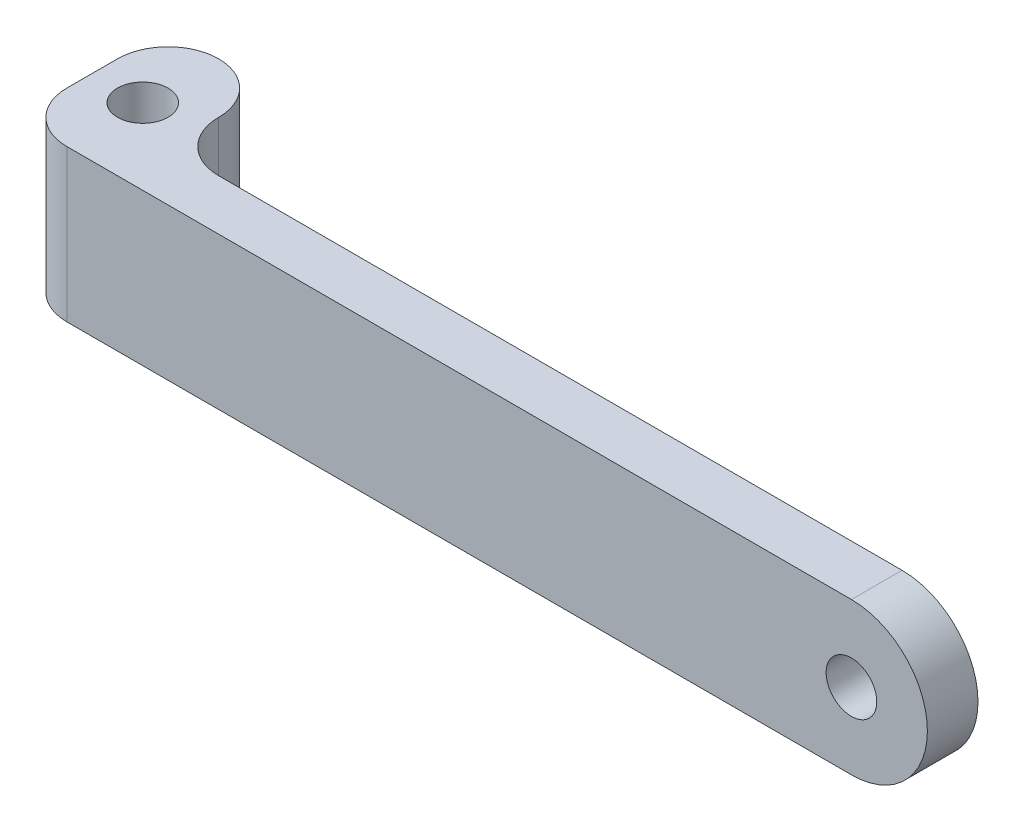
ISO-10303-21;
HEADER;
FILE_DESCRIPTION(('STEP AP214'),'2;1');
FILE_NAME('part.step','',(''),(''),'','','');
FILE_SCHEMA(('AUTOMOTIVE_DESIGN { 1 0 10303 214 1 1 1 1 }'));
ENDSEC;
DATA;
#1=APPLICATION_CONTEXT('core data for automotive mechanical design processes');
#2=APPLICATION_PROTOCOL_DEFINITION('international standard','automotive_design',2000,#1);
#3=PRODUCT_CONTEXT('',#1,'mechanical');
#4=PRODUCT('Part','Part','',(#3));
#5=PRODUCT_RELATED_PRODUCT_CATEGORY('part','',(#4));
#6=PRODUCT_DEFINITION_FORMATION('','',#4);
#7=PRODUCT_DEFINITION_CONTEXT('part definition',#1,'design');
#8=PRODUCT_DEFINITION('design','',#6,#7);
#9=PRODUCT_DEFINITION_SHAPE('','',#8);
#10=(LENGTH_UNIT() NAMED_UNIT(*) SI_UNIT(.MILLI.,.METRE.));
#11=(NAMED_UNIT(*) PLANE_ANGLE_UNIT() SI_UNIT($,.RADIAN.));
#12=(NAMED_UNIT(*) SI_UNIT($,.STERADIAN.) SOLID_ANGLE_UNIT());
#13=UNCERTAINTY_MEASURE_WITH_UNIT(LENGTH_MEASURE(1.E-05),#10,'distance_accuracy_value','');
#14=(GEOMETRIC_REPRESENTATION_CONTEXT(3) GLOBAL_UNCERTAINTY_ASSIGNED_CONTEXT((#13)) GLOBAL_UNIT_ASSIGNED_CONTEXT((#10,
#11,#12)) REPRESENTATION_CONTEXT('',''));
#15=CARTESIAN_POINT('',(0.,0.,0.));
#16=DIRECTION('',(0.,0.,1.));
#17=DIRECTION('',(1.,0.,0.));
#18=AXIS2_PLACEMENT_3D('',#15,#16,#17);
#19=CARTESIAN_POINT('',(0.,-7.5,5.));
#20=DIRECTION('',(0.,1.,0.));
#21=DIRECTION('',(-1.,0.,0.));
#22=AXIS2_PLACEMENT_3D('',#19,#20,#21);
#23=PLANE('',#22);
#24=CARTESIAN_POINT('',(-2.5,-7.5,-2.5));
#25=DIRECTION('',(0.,1.,0.));
#26=DIRECTION('',(-1.,0.,0.));
#27=AXIS2_PLACEMENT_3D('',#24,#25,#26);
#28=CIRCLE('',#27,2.5);
#29=CARTESIAN_POINT('',(-5.,-7.5,-2.5));
#30=VERTEX_POINT('',#29);
#31=EDGE_CURVE('E169',#30,#30,#28,.T.);
#32=ORIENTED_EDGE('',*,*,#31,.T.);
#33=EDGE_LOOP('',(#32));
#34=FACE_BOUND('',#33,.T.);
#35=DIRECTION('',(1.,0.,0.));
#36=VECTOR('',#35,1.);
#37=CARTESIAN_POINT('',(0.,-7.5,5.));
#38=LINE('',#37,#36);
#39=CARTESIAN_POINT('',(-2.5,-7.5,5.));
#40=VERTEX_POINT('',#39);
#41=CARTESIAN_POINT('',(75.,-7.5,5.));
#42=VERTEX_POINT('',#41);
#43=EDGE_CURVE('E100',#40,#42,#38,.T.);
#44=ORIENTED_EDGE('',*,*,#43,.F.);
#45=CARTESIAN_POINT('',(-2.5,-7.5,0.));
#46=DIRECTION('',(0.,1.,0.));
#47=DIRECTION('',(-1.,0.,0.));
#48=AXIS2_PLACEMENT_3D('',#45,#46,#47);
#49=CIRCLE('',#48,5.);
#50=CARTESIAN_POINT('',(-7.5,-7.5,0.));
#51=VERTEX_POINT('',#50);
#52=EDGE_CURVE('E155',#40,#51,#49,.F.);
#53=ORIENTED_EDGE('',*,*,#52,.T.);
#54=DIRECTION('',(0.,0.,1.));
#55=VECTOR('',#54,1.);
#56=CARTESIAN_POINT('',(-7.5,-7.5,5.));
#57=LINE('',#56,#55);
#58=CARTESIAN_POINT('',(-7.5,-7.5,-5.));
#59=VERTEX_POINT('',#58);
#60=EDGE_CURVE('E134',#59,#51,#57,.T.);
#61=ORIENTED_EDGE('',*,*,#60,.F.);
#62=CARTESIAN_POINT('',(-2.5,-7.5,-5.));
#63=DIRECTION('',(0.,1.,0.));
#64=DIRECTION('',(-1.,0.,0.));
#65=AXIS2_PLACEMENT_3D('',#62,#63,#64);
#66=CIRCLE('',#65,5.);
#67=CARTESIAN_POINT('',(-2.5,-7.5,-10.));
#68=VERTEX_POINT('',#67);
#69=EDGE_CURVE('E152',#59,#68,#66,.F.);
#70=ORIENTED_EDGE('',*,*,#69,.T.);
#71=CARTESIAN_POINT('',(-2.5,-7.5,-5.));
#72=DIRECTION('',(0.,1.,0.));
#73=DIRECTION('',(-1.,0.,0.));
#74=AXIS2_PLACEMENT_3D('',#71,#72,#73);
#75=CIRCLE('',#74,5.);
#76=CARTESIAN_POINT('',(2.5,-7.5,-5.));
#77=VERTEX_POINT('',#76);
#78=EDGE_CURVE('E56',#68,#77,#75,.F.);
#79=ORIENTED_EDGE('',*,*,#78,.T.);
#80=CARTESIAN_POINT('',(7.5,-7.5,-5.));
#81=DIRECTION('',(0.,1.,0.));
#82=DIRECTION('',(-1.,0.,0.));
#83=AXIS2_PLACEMENT_3D('',#80,#81,#82);
#84=CIRCLE('',#83,5.);
#85=CARTESIAN_POINT('',(7.5,-7.5,0.));
#86=VERTEX_POINT('',#85);
#87=EDGE_CURVE('E11',#77,#86,#84,.T.);
#88=ORIENTED_EDGE('',*,*,#87,.T.);
#89=DIRECTION('',(1.,0.,0.));
#90=VECTOR('',#89,1.);
#91=CARTESIAN_POINT('',(0.,-7.5,0.));
#92=LINE('',#91,#90);
#93=CARTESIAN_POINT('',(75.,-7.5,0.));
#94=VERTEX_POINT('',#93);
#95=EDGE_CURVE('E115',#86,#94,#92,.T.);
#96=ORIENTED_EDGE('',*,*,#95,.T.);
#97=DIRECTION('',(0.,0.,-1.));
#98=VECTOR('',#97,1.);
#99=CARTESIAN_POINT('',(75.,-7.5,5.));
#100=LINE('',#99,#98);
#101=EDGE_CURVE('E114',#42,#94,#100,.T.);
#102=ORIENTED_EDGE('',*,*,#101,.F.);
#103=EDGE_LOOP('',(#44,#53,#61,#70,#79,#88,#96,#102));
#104=FACE_BOUND('',#103,.T.);
#105=ADVANCED_FACE('F36',(#34,#104),#23,.F.);
#106=CARTESIAN_POINT('',(75.,0.,5.));
#107=DIRECTION('',(0.,0.,-1.));
#108=DIRECTION('',(-1.,0.,0.));
#109=AXIS2_PLACEMENT_3D('',#106,#107,#108);
#110=CYLINDRICAL_SURFACE('',#109,7.5);
#111=CARTESIAN_POINT('',(75.,0.,0.));
#112=DIRECTION('',(0.,0.,1.));
#113=DIRECTION('',(1.,0.,0.));
#114=AXIS2_PLACEMENT_3D('',#111,#112,#113);
#115=CIRCLE('',#114,7.5);
#116=CARTESIAN_POINT('',(75.,7.5,0.));
#117=VERTEX_POINT('',#116);
#118=EDGE_CURVE('E133',#94,#117,#115,.T.);
#119=ORIENTED_EDGE('',*,*,#118,.T.);
#120=DIRECTION('',(0.,0.,-1.));
#121=VECTOR('',#120,1.);
#122=CARTESIAN_POINT('',(75.,7.5,5.));
#123=LINE('',#122,#121);
#124=CARTESIAN_POINT('',(75.,7.5,5.));
#125=VERTEX_POINT('',#124);
#126=EDGE_CURVE('E120',#125,#117,#123,.T.);
#127=ORIENTED_EDGE('',*,*,#126,.F.);
#128=CARTESIAN_POINT('',(75.,0.,5.));
#129=DIRECTION('',(0.,0.,1.));
#130=DIRECTION('',(1.,0.,0.));
#131=AXIS2_PLACEMENT_3D('',#128,#129,#130);
#132=CIRCLE('',#131,7.5);
#133=EDGE_CURVE('E106',#42,#125,#132,.T.);
#134=ORIENTED_EDGE('',*,*,#133,.F.);
#135=ORIENTED_EDGE('',*,*,#101,.T.);
#136=EDGE_LOOP('',(#119,#127,#134,#135));
#137=FACE_BOUND('',#136,.T.);
#138=ADVANCED_FACE('F122',(#137),#110,.T.);
#139=CARTESIAN_POINT('',(0.,7.5,5.));
#140=DIRECTION('',(0.,1.,0.));
#141=DIRECTION('',(-1.,0.,0.));
#142=AXIS2_PLACEMENT_3D('',#139,#140,#141);
#143=PLANE('',#142);
#144=CARTESIAN_POINT('',(-2.5,7.5,-2.5));
#145=DIRECTION('',(0.,1.,0.));
#146=DIRECTION('',(-1.,0.,0.));
#147=AXIS2_PLACEMENT_3D('',#144,#145,#146);
#148=CIRCLE('',#147,2.5);
#149=CARTESIAN_POINT('',(-5.,7.5,-2.5));
#150=VERTEX_POINT('',#149);
#151=EDGE_CURVE('E164',#150,#150,#148,.T.);
#152=ORIENTED_EDGE('',*,*,#151,.F.);
#153=EDGE_LOOP('',(#152));
#154=FACE_BOUND('',#153,.T.);
#155=DIRECTION('',(0.,0.,1.));
#156=VECTOR('',#155,1.);
#157=CARTESIAN_POINT('',(-7.5,7.5,5.));
#158=LINE('',#157,#156);
#159=CARTESIAN_POINT('',(-7.5,7.5,-5.));
#160=VERTEX_POINT('',#159);
#161=CARTESIAN_POINT('',(-7.5,7.5,0.));
#162=VERTEX_POINT('',#161);
#163=EDGE_CURVE('E174',#160,#162,#158,.T.);
#164=ORIENTED_EDGE('',*,*,#163,.T.);
#165=CARTESIAN_POINT('',(-2.5,7.5,0.));
#166=DIRECTION('',(0.,1.,0.));
#167=DIRECTION('',(-1.,0.,0.));
#168=AXIS2_PLACEMENT_3D('',#165,#166,#167);
#169=CIRCLE('',#168,5.);
#170=CARTESIAN_POINT('',(-2.5,7.5,5.));
#171=VERTEX_POINT('',#170);
#172=EDGE_CURVE('E149',#162,#171,#169,.T.);
#173=ORIENTED_EDGE('',*,*,#172,.T.);
#174=DIRECTION('',(1.,0.,0.));
#175=VECTOR('',#174,1.);
#176=CARTESIAN_POINT('',(0.,7.5,5.));
#177=LINE('',#176,#175);
#178=EDGE_CURVE('E124',#171,#125,#177,.T.);
#179=ORIENTED_EDGE('',*,*,#178,.T.);
#180=ORIENTED_EDGE('',*,*,#126,.T.);
#181=DIRECTION('',(1.,0.,0.));
#182=VECTOR('',#181,1.);
#183=CARTESIAN_POINT('',(0.,7.5,0.));
#184=LINE('',#183,#182);
#185=CARTESIAN_POINT('',(7.5,7.5,0.));
#186=VERTEX_POINT('',#185);
#187=EDGE_CURVE('E136',#186,#117,#184,.T.);
#188=ORIENTED_EDGE('',*,*,#187,.F.);
#189=CARTESIAN_POINT('',(7.5,7.5,-5.));
#190=DIRECTION('',(0.,1.,0.));
#191=DIRECTION('',(-1.,0.,0.));
#192=AXIS2_PLACEMENT_3D('',#189,#190,#191);
#193=CIRCLE('',#192,5.);
#194=CARTESIAN_POINT('',(2.5,7.5,-5.));
#195=VERTEX_POINT('',#194);
#196=EDGE_CURVE('E45',#186,#195,#193,.F.);
#197=ORIENTED_EDGE('',*,*,#196,.T.);
#198=CARTESIAN_POINT('',(-2.5,7.5,-5.));
#199=DIRECTION('',(0.,1.,0.));
#200=DIRECTION('',(-1.,0.,0.));
#201=AXIS2_PLACEMENT_3D('',#198,#199,#200);
#202=CIRCLE('',#201,5.);
#203=CARTESIAN_POINT('',(-2.5,7.5,-10.));
#204=VERTEX_POINT('',#203);
#205=EDGE_CURVE('E147',#195,#204,#202,.T.);
#206=ORIENTED_EDGE('',*,*,#205,.T.);
#207=CARTESIAN_POINT('',(-2.5,7.5,-5.));
#208=DIRECTION('',(0.,1.,0.));
#209=DIRECTION('',(-1.,0.,0.));
#210=AXIS2_PLACEMENT_3D('',#207,#208,#209);
#211=CIRCLE('',#210,5.);
#212=EDGE_CURVE('E145',#204,#160,#211,.T.);
#213=ORIENTED_EDGE('',*,*,#212,.T.);
#214=EDGE_LOOP('',(#164,#173,#179,#180,#188,#197,#206,#213));
#215=FACE_BOUND('',#214,.T.);
#216=ADVANCED_FACE('F181',(#154,#215),#143,.T.);
#217=CARTESIAN_POINT('',(75.,0.,5.));
#218=DIRECTION('',(0.,0.,-1.));
#219=DIRECTION('',(-1.,0.,0.));
#220=AXIS2_PLACEMENT_3D('',#217,#218,#219);
#221=CYLINDRICAL_SURFACE('',#220,2.50000000000001);
#222=CARTESIAN_POINT('',(75.,0.,5.));
#223=DIRECTION('',(0.,0.,1.));
#224=DIRECTION('',(1.,0.,0.));
#225=AXIS2_PLACEMENT_3D('',#222,#223,#224);
#226=CIRCLE('',#225,2.50000000000001);
#227=CARTESIAN_POINT('',(77.5,0.,5.));
#228=VERTEX_POINT('',#227);
#229=EDGE_CURVE('E126',#228,#228,#226,.T.);
#230=ORIENTED_EDGE('',*,*,#229,.T.);
#231=EDGE_LOOP('',(#230));
#232=FACE_BOUND('',#231,.T.);
#233=CARTESIAN_POINT('',(75.,0.,0.));
#234=DIRECTION('',(0.,0.,1.));
#235=DIRECTION('',(1.,0.,0.));
#236=AXIS2_PLACEMENT_3D('',#233,#234,#235);
#237=CIRCLE('',#236,2.50000000000001);
#238=CARTESIAN_POINT('',(77.5,0.,0.));
#239=VERTEX_POINT('',#238);
#240=EDGE_CURVE('E111',#239,#239,#237,.T.);
#241=ORIENTED_EDGE('',*,*,#240,.F.);
#242=EDGE_LOOP('',(#241));
#243=FACE_BOUND('',#242,.T.);
#244=ADVANCED_FACE('F213',(#232,#243),#221,.F.);
#245=CARTESIAN_POINT('',(0.,0.,5.));
#246=DIRECTION('',(0.,0.,1.));
#247=DIRECTION('',(1.,0.,0.));
#248=AXIS2_PLACEMENT_3D('',#245,#246,#247);
#249=PLANE('',#248);
#250=ORIENTED_EDGE('',*,*,#178,.F.);
#251=DIRECTION('',(0.,1.,0.));
#252=VECTOR('',#251,1.);
#253=CARTESIAN_POINT('',(-2.5,0.,5.));
#254=LINE('',#253,#252);
#255=EDGE_CURVE('E109',#171,#40,#254,.F.);
#256=ORIENTED_EDGE('',*,*,#255,.T.);
#257=ORIENTED_EDGE('',*,*,#43,.T.);
#258=ORIENTED_EDGE('',*,*,#133,.T.);
#259=EDGE_LOOP('',(#250,#256,#257,#258));
#260=FACE_BOUND('',#259,.T.);
#261=ORIENTED_EDGE('',*,*,#229,.F.);
#262=EDGE_LOOP('',(#261));
#263=FACE_BOUND('',#262,.T.);
#264=ADVANCED_FACE('F103',(#260,#263),#249,.T.);
#265=CARTESIAN_POINT('',(0.,0.,0.));
#266=DIRECTION('',(0.,0.,1.));
#267=DIRECTION('',(1.,0.,0.));
#268=AXIS2_PLACEMENT_3D('',#265,#266,#267);
#269=PLANE('',#268);
#270=ORIENTED_EDGE('',*,*,#95,.F.);
#271=DIRECTION('',(0.,1.,0.));
#272=VECTOR('',#271,1.);
#273=CARTESIAN_POINT('',(7.5,0.,0.));
#274=LINE('',#273,#272);
#275=EDGE_CURVE('E157',#86,#186,#274,.T.);
#276=ORIENTED_EDGE('',*,*,#275,.T.);
#277=ORIENTED_EDGE('',*,*,#187,.T.);
#278=ORIENTED_EDGE('',*,*,#118,.F.);
#279=EDGE_LOOP('',(#270,#276,#277,#278));
#280=FACE_BOUND('',#279,.T.);
#281=ORIENTED_EDGE('',*,*,#240,.T.);
#282=EDGE_LOOP('',(#281));
#283=FACE_BOUND('',#282,.T.);
#284=ADVANCED_FACE('F218',(#280,#283),#269,.F.);
#285=CARTESIAN_POINT('',(-7.5,-7.5,5.));
#286=DIRECTION('',(-1.,0.,0.));
#287=DIRECTION('',(0.,-1.,0.));
#288=AXIS2_PLACEMENT_3D('',#285,#286,#287);
#289=PLANE('',#288);
#290=ORIENTED_EDGE('',*,*,#60,.T.);
#291=DIRECTION('',(0.,1.,0.));
#292=VECTOR('',#291,1.);
#293=CARTESIAN_POINT('',(-7.5,-7.5,0.));
#294=LINE('',#293,#292);
#295=EDGE_CURVE('E142',#51,#162,#294,.T.);
#296=ORIENTED_EDGE('',*,*,#295,.T.);
#297=ORIENTED_EDGE('',*,*,#163,.F.);
#298=DIRECTION('',(0.,1.,0.));
#299=VECTOR('',#298,1.);
#300=CARTESIAN_POINT('',(-7.5,-7.5,-5.));
#301=LINE('',#300,#299);
#302=EDGE_CURVE('E119',#160,#59,#301,.F.);
#303=ORIENTED_EDGE('',*,*,#302,.T.);
#304=EDGE_LOOP('',(#290,#296,#297,#303));
#305=FACE_BOUND('',#304,.T.);
#306=ADVANCED_FACE('F185',(#305),#289,.T.);
#307=CARTESIAN_POINT('',(-2.5,-7.5,-2.5));
#308=DIRECTION('',(0.,1.,0.));
#309=DIRECTION('',(-1.,0.,0.));
#310=AXIS2_PLACEMENT_3D('',#307,#308,#309);
#311=CYLINDRICAL_SURFACE('',#310,2.5);
#312=ORIENTED_EDGE('',*,*,#31,.F.);
#313=EDGE_LOOP('',(#312));
#314=FACE_BOUND('',#313,.T.);
#315=ORIENTED_EDGE('',*,*,#151,.T.);
#316=EDGE_LOOP('',(#315));
#317=FACE_BOUND('',#316,.T.);
#318=ADVANCED_FACE('F193',(#314,#317),#311,.F.);
#319=CARTESIAN_POINT('',(-2.5,-7.5,0.));
#320=DIRECTION('',(0.,1.,0.));
#321=DIRECTION('',(-1.,0.,0.));
#322=AXIS2_PLACEMENT_3D('',#319,#320,#321);
#323=CYLINDRICAL_SURFACE('',#322,5.);
#324=ORIENTED_EDGE('',*,*,#52,.F.);
#325=ORIENTED_EDGE('',*,*,#255,.F.);
#326=ORIENTED_EDGE('',*,*,#172,.F.);
#327=ORIENTED_EDGE('',*,*,#295,.F.);
#328=EDGE_LOOP('',(#324,#325,#326,#327));
#329=FACE_BOUND('',#328,.T.);
#330=ADVANCED_FACE('F191',(#329),#323,.T.);
#331=CARTESIAN_POINT('',(-2.5,-7.5,-5.));
#332=DIRECTION('',(0.,1.,0.));
#333=DIRECTION('',(-1.,0.,0.));
#334=AXIS2_PLACEMENT_3D('',#331,#332,#333);
#335=CYLINDRICAL_SURFACE('',#334,5.);
#336=ORIENTED_EDGE('',*,*,#302,.F.);
#337=ORIENTED_EDGE('',*,*,#212,.F.);
#338=DIRECTION('',(0.,1.,0.));
#339=VECTOR('',#338,1.);
#340=CARTESIAN_POINT('',(-2.5,-7.5,-10.));
#341=LINE('',#340,#339);
#342=EDGE_CURVE('E40',#68,#204,#341,.T.);
#343=ORIENTED_EDGE('',*,*,#342,.F.);
#344=ORIENTED_EDGE('',*,*,#69,.F.);
#345=EDGE_LOOP('',(#336,#337,#343,#344));
#346=FACE_BOUND('',#345,.T.);
#347=ADVANCED_FACE('F38',(#346),#335,.T.);
#348=CARTESIAN_POINT('',(-2.5,-7.5,-5.));
#349=DIRECTION('',(0.,1.,0.));
#350=DIRECTION('',(-1.,0.,0.));
#351=AXIS2_PLACEMENT_3D('',#348,#349,#350);
#352=CYLINDRICAL_SURFACE('',#351,5.);
#353=DIRECTION('',(0.,1.,0.));
#354=VECTOR('',#353,1.);
#355=CARTESIAN_POINT('',(2.5,-7.5,-5.));
#356=LINE('',#355,#354);
#357=EDGE_CURVE('E160',#77,#195,#356,.T.);
#358=ORIENTED_EDGE('',*,*,#357,.F.);
#359=ORIENTED_EDGE('',*,*,#78,.F.);
#360=ORIENTED_EDGE('',*,*,#342,.T.);
#361=ORIENTED_EDGE('',*,*,#205,.F.);
#362=EDGE_LOOP('',(#358,#359,#360,#361));
#363=FACE_BOUND('',#362,.T.);
#364=ADVANCED_FACE('F199',(#363),#352,.T.);
#365=CARTESIAN_POINT('',(7.5,0.,-5.));
#366=DIRECTION('',(0.,1.,0.));
#367=DIRECTION('',(-1.,0.,0.));
#368=AXIS2_PLACEMENT_3D('',#365,#366,#367);
#369=CYLINDRICAL_SURFACE('',#368,5.);
#370=ORIENTED_EDGE('',*,*,#87,.F.);
#371=ORIENTED_EDGE('',*,*,#357,.T.);
#372=ORIENTED_EDGE('',*,*,#196,.F.);
#373=ORIENTED_EDGE('',*,*,#275,.F.);
#374=EDGE_LOOP('',(#370,#371,#372,#373));
#375=FACE_BOUND('',#374,.T.);
#376=ADVANCED_FACE('F307',(#375),#369,.F.);
#377=CLOSED_SHELL('',(#105,#138,#216,#244,#264,#284,#306,#318,#330,#347,#364,#376));
#378=MANIFOLD_SOLID_BREP('B2',#377);
#379=ADVANCED_BREP_SHAPE_REPRESENTATION('',(#18,#378),#14);
#380=SHAPE_DEFINITION_REPRESENTATION(#9,#379);
ENDSEC;
END-ISO-10303-21;
